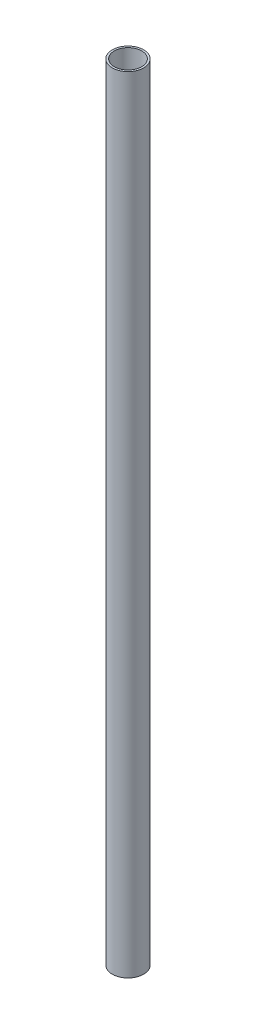
ISO-10303-21;
HEADER;
FILE_DESCRIPTION(('STEP AP214'),'2;1');
FILE_NAME('part.step','',(''),(''),'','','');
FILE_SCHEMA(('AUTOMOTIVE_DESIGN { 1 0 10303 214 1 1 1 1 }'));
ENDSEC;
DATA;
#1=APPLICATION_CONTEXT('core data for automotive mechanical design processes');
#2=APPLICATION_PROTOCOL_DEFINITION('international standard','automotive_design',2000,#1);
#3=PRODUCT_CONTEXT('',#1,'mechanical');
#4=PRODUCT('Part','Part','',(#3));
#5=PRODUCT_RELATED_PRODUCT_CATEGORY('part','',(#4));
#6=PRODUCT_DEFINITION_FORMATION('','',#4);
#7=PRODUCT_DEFINITION_CONTEXT('part definition',#1,'design');
#8=PRODUCT_DEFINITION('design','',#6,#7);
#9=PRODUCT_DEFINITION_SHAPE('','',#8);
#10=(LENGTH_UNIT() NAMED_UNIT(*) SI_UNIT(.MILLI.,.METRE.));
#11=(NAMED_UNIT(*) PLANE_ANGLE_UNIT() SI_UNIT($,.RADIAN.));
#12=(NAMED_UNIT(*) SI_UNIT($,.STERADIAN.) SOLID_ANGLE_UNIT());
#13=UNCERTAINTY_MEASURE_WITH_UNIT(LENGTH_MEASURE(1.E-05),#10,'distance_accuracy_value','');
#14=(GEOMETRIC_REPRESENTATION_CONTEXT(3) GLOBAL_UNCERTAINTY_ASSIGNED_CONTEXT((#13)) GLOBAL_UNIT_ASSIGNED_CONTEXT((#10,
#11,#12)) REPRESENTATION_CONTEXT('',''));
#15=CARTESIAN_POINT('',(0.,0.,0.));
#16=DIRECTION('',(0.,0.,1.));
#17=DIRECTION('',(1.,0.,0.));
#18=AXIS2_PLACEMENT_3D('',#15,#16,#17);
#19=CARTESIAN_POINT('',(0.,200.,0.));
#20=DIRECTION('',(0.,1.,0.));
#21=DIRECTION('',(0.,0.,1.));
#22=AXIS2_PLACEMENT_3D('',#19,#20,#21);
#23=PLANE('',#22);
#24=CARTESIAN_POINT('',(0.,200.,0.));
#25=DIRECTION('',(0.,1.,0.));
#26=DIRECTION('',(0.,0.,1.));
#27=AXIS2_PLACEMENT_3D('',#24,#25,#26);
#28=CIRCLE('',#27,8.);
#29=CARTESIAN_POINT('',(0.,200.,8.));
#30=VERTEX_POINT('',#29);
#31=EDGE_CURVE('E10',#30,#30,#28,.T.);
#32=ORIENTED_EDGE('',*,*,#31,.T.);
#33=EDGE_LOOP('',(#32));
#34=FACE_BOUND('',#33,.T.);
#35=CARTESIAN_POINT('',(0.,200.,0.));
#36=DIRECTION('',(0.,1.,0.));
#37=DIRECTION('',(0.,0.,1.));
#38=AXIS2_PLACEMENT_3D('',#35,#36,#37);
#39=CIRCLE('',#38,7.);
#40=CARTESIAN_POINT('',(0.,200.,7.));
#41=VERTEX_POINT('',#40);
#42=EDGE_CURVE('E56',#41,#41,#39,.T.);
#43=ORIENTED_EDGE('',*,*,#42,.F.);
#44=EDGE_LOOP('',(#43));
#45=FACE_BOUND('',#44,.T.);
#46=ADVANCED_FACE('F43',(#34,#45),#23,.T.);
#47=CARTESIAN_POINT('',(0.,-200.,0.));
#48=DIRECTION('',(0.,1.,0.));
#49=DIRECTION('',(0.,0.,1.));
#50=AXIS2_PLACEMENT_3D('',#47,#48,#49);
#51=PLANE('',#50);
#52=CARTESIAN_POINT('',(0.,-200.,0.));
#53=DIRECTION('',(0.,1.,0.));
#54=DIRECTION('',(0.,0.,1.));
#55=AXIS2_PLACEMENT_3D('',#52,#53,#54);
#56=CIRCLE('',#55,8.);
#57=CARTESIAN_POINT('',(0.,-200.,8.));
#58=VERTEX_POINT('',#57);
#59=EDGE_CURVE('E47',#58,#58,#56,.T.);
#60=ORIENTED_EDGE('',*,*,#59,.F.);
#61=EDGE_LOOP('',(#60));
#62=FACE_BOUND('',#61,.T.);
#63=CARTESIAN_POINT('',(0.,-200.,0.));
#64=DIRECTION('',(0.,1.,0.));
#65=DIRECTION('',(0.,0.,1.));
#66=AXIS2_PLACEMENT_3D('',#63,#64,#65);
#67=CIRCLE('',#66,7.);
#68=CARTESIAN_POINT('',(0.,-200.,7.));
#69=VERTEX_POINT('',#68);
#70=EDGE_CURVE('E58',#69,#69,#67,.T.);
#71=ORIENTED_EDGE('',*,*,#70,.T.);
#72=EDGE_LOOP('',(#71));
#73=FACE_BOUND('',#72,.T.);
#74=ADVANCED_FACE('F70',(#62,#73),#51,.F.);
#75=CARTESIAN_POINT('',(0.,200.,0.));
#76=DIRECTION('',(0.,-1.,0.));
#77=DIRECTION('',(0.,0.,-1.));
#78=AXIS2_PLACEMENT_3D('',#75,#76,#77);
#79=CYLINDRICAL_SURFACE('',#78,8.);
#80=ORIENTED_EDGE('',*,*,#31,.F.);
#81=EDGE_LOOP('',(#80));
#82=FACE_BOUND('',#81,.T.);
#83=ORIENTED_EDGE('',*,*,#59,.T.);
#84=EDGE_LOOP('',(#83));
#85=FACE_BOUND('',#84,.T.);
#86=ADVANCED_FACE('F45',(#82,#85),#79,.T.);
#87=CARTESIAN_POINT('',(0.,200.,0.));
#88=DIRECTION('',(0.,-1.,0.));
#89=DIRECTION('',(0.,0.,-1.));
#90=AXIS2_PLACEMENT_3D('',#87,#88,#89);
#91=CYLINDRICAL_SURFACE('',#90,7.);
#92=ORIENTED_EDGE('',*,*,#42,.T.);
#93=EDGE_LOOP('',(#92));
#94=FACE_BOUND('',#93,.T.);
#95=ORIENTED_EDGE('',*,*,#70,.F.);
#96=EDGE_LOOP('',(#95));
#97=FACE_BOUND('',#96,.T.);
#98=ADVANCED_FACE('F66',(#94,#97),#91,.F.);
#99=CLOSED_SHELL('',(#46,#74,#86,#98));
#100=MANIFOLD_SOLID_BREP('B2',#99);
#101=ADVANCED_BREP_SHAPE_REPRESENTATION('',(#18,#100),#14);
#102=SHAPE_DEFINITION_REPRESENTATION(#9,#101);
ENDSEC;
END-ISO-10303-21;
